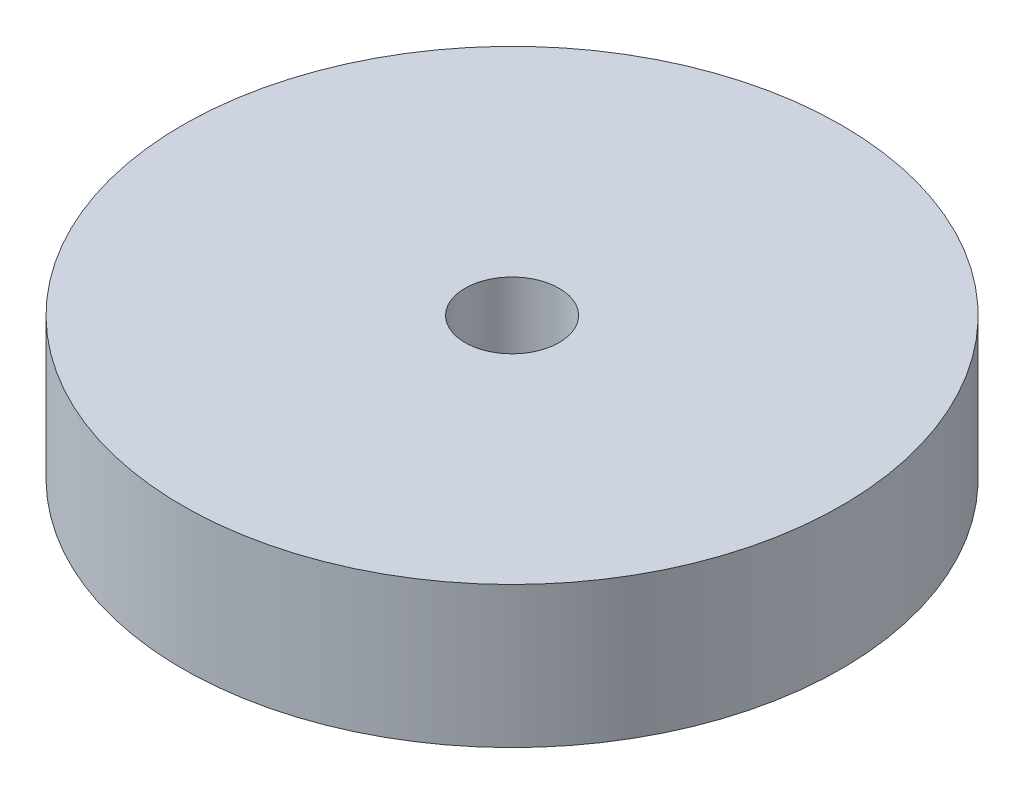
ISO-10303-21;
HEADER;
FILE_DESCRIPTION(('STEP AP214'),'2;1');
FILE_NAME('part.step','',(''),(''),'','','');
FILE_SCHEMA(('AUTOMOTIVE_DESIGN { 1 0 10303 214 1 1 1 1 }'));
ENDSEC;
DATA;
#1=APPLICATION_CONTEXT('core data for automotive mechanical design processes');
#2=APPLICATION_PROTOCOL_DEFINITION('international standard','automotive_design',2000,#1);
#3=PRODUCT_CONTEXT('',#1,'mechanical');
#4=PRODUCT('Part','Part','',(#3));
#5=PRODUCT_RELATED_PRODUCT_CATEGORY('part','',(#4));
#6=PRODUCT_DEFINITION_FORMATION('','',#4);
#7=PRODUCT_DEFINITION_CONTEXT('part definition',#1,'design');
#8=PRODUCT_DEFINITION('design','',#6,#7);
#9=PRODUCT_DEFINITION_SHAPE('','',#8);
#10=(LENGTH_UNIT() NAMED_UNIT(*) SI_UNIT(.MILLI.,.METRE.));
#11=(NAMED_UNIT(*) PLANE_ANGLE_UNIT() SI_UNIT($,.RADIAN.));
#12=(NAMED_UNIT(*) SI_UNIT($,.STERADIAN.) SOLID_ANGLE_UNIT());
#13=UNCERTAINTY_MEASURE_WITH_UNIT(LENGTH_MEASURE(1.E-05),#10,'distance_accuracy_value','');
#14=(GEOMETRIC_REPRESENTATION_CONTEXT(3) GLOBAL_UNCERTAINTY_ASSIGNED_CONTEXT((#13)) GLOBAL_UNIT_ASSIGNED_CONTEXT((#10,
#11,#12)) REPRESENTATION_CONTEXT('',''));
#15=CARTESIAN_POINT('',(0.,0.,0.));
#16=DIRECTION('',(0.,0.,1.));
#17=DIRECTION('',(1.,0.,0.));
#18=AXIS2_PLACEMENT_3D('',#15,#16,#17);
#19=CARTESIAN_POINT('',(-9.11732131638871,12.7,0.));
#20=DIRECTION('',(0.,-1.,0.));
#21=DIRECTION('',(0.,0.,-1.));
#22=AXIS2_PLACEMENT_3D('',#19,#20,#21);
#23=CYLINDRICAL_SURFACE('',#22,5.);
#24=CARTESIAN_POINT('',(-9.11732131638871,7.51908048794975,0.));
#25=DIRECTION('',(0.,-1.,0.));
#26=DIRECTION('',(0.,0.,-1.));
#27=AXIS2_PLACEMENT_3D('',#24,#25,#26);
#28=CIRCLE('',#27,5.);
#29=CARTESIAN_POINT('',(-9.11732131638871,7.51908048794975,-5.));
#30=VERTEX_POINT('',#29);
#31=EDGE_CURVE('E10',#30,#30,#28,.T.);
#32=ORIENTED_EDGE('',*,*,#31,.F.);
#33=EDGE_LOOP('',(#32));
#34=FACE_BOUND('',#33,.T.);
#35=CARTESIAN_POINT('',(-9.11732131638871,10.0190804879498,0.));
#36=DIRECTION('',(0.,-1.,0.));
#37=DIRECTION('',(0.,0.,-1.));
#38=AXIS2_PLACEMENT_3D('',#35,#36,#37);
#39=CIRCLE('',#38,5.);
#40=CARTESIAN_POINT('',(-9.11732131638871,10.0190804879498,-5.));
#41=VERTEX_POINT('',#40);
#42=EDGE_CURVE('E61',#41,#41,#39,.T.);
#43=ORIENTED_EDGE('',*,*,#42,.T.);
#44=EDGE_LOOP('',(#43));
#45=FACE_BOUND('',#44,.T.);
#46=ADVANCED_FACE('F33',(#34,#45),#23,.T.);
#47=CARTESIAN_POINT('',(-14.1173213163887,7.51908048794975,0.));
#48=DIRECTION('',(0.,1.,0.));
#49=DIRECTION('',(0.,0.,1.));
#50=AXIS2_PLACEMENT_3D('',#47,#48,#49);
#51=PLANE('',#50);
#52=CARTESIAN_POINT('',(-9.11732131638871,7.51908048794975,0.));
#53=DIRECTION('',(0.,-1.,0.));
#54=DIRECTION('',(0.,0.,-1.));
#55=AXIS2_PLACEMENT_3D('',#52,#53,#54);
#56=CIRCLE('',#55,2.5);
#57=CARTESIAN_POINT('',(-9.11732131638871,7.51908048794975,-2.5));
#58=VERTEX_POINT('',#57);
#59=EDGE_CURVE('E39',#58,#58,#56,.T.);
#60=ORIENTED_EDGE('',*,*,#59,.F.);
#61=EDGE_LOOP('',(#60));
#62=FACE_BOUND('',#61,.T.);
#63=ORIENTED_EDGE('',*,*,#31,.T.);
#64=EDGE_LOOP('',(#63));
#65=FACE_BOUND('',#64,.T.);
#66=ADVANCED_FACE('F98',(#62,#65),#51,.F.);
#67=CARTESIAN_POINT('',(-9.11732131638871,12.7,0.));
#68=DIRECTION('',(0.,-1.,0.));
#69=DIRECTION('',(0.,0.,-1.));
#70=AXIS2_PLACEMENT_3D('',#67,#68,#69);
#71=CYLINDRICAL_SURFACE('',#70,2.5);
#72=CARTESIAN_POINT('',(-9.11732131638871,12.5190804879498,0.));
#73=DIRECTION('',(0.,-1.,0.));
#74=DIRECTION('',(0.,0.,-1.));
#75=AXIS2_PLACEMENT_3D('',#72,#73,#74);
#76=CIRCLE('',#75,2.5);
#77=CARTESIAN_POINT('',(-9.11732131638871,12.5190804879498,-2.5));
#78=VERTEX_POINT('',#77);
#79=EDGE_CURVE('E43',#78,#78,#76,.T.);
#80=ORIENTED_EDGE('',*,*,#79,.F.);
#81=EDGE_LOOP('',(#80));
#82=FACE_BOUND('',#81,.T.);
#83=ORIENTED_EDGE('',*,*,#59,.T.);
#84=EDGE_LOOP('',(#83));
#85=FACE_BOUND('',#84,.T.);
#86=ADVANCED_FACE('F93',(#82,#85),#71,.F.);
#87=CARTESIAN_POINT('',(-26.6173213163887,12.5190804879498,0.));
#88=DIRECTION('',(0.,-1.,0.));
#89=DIRECTION('',(0.,0.,-1.));
#90=AXIS2_PLACEMENT_3D('',#87,#88,#89);
#91=PLANE('',#90);
#92=CARTESIAN_POINT('',(-9.11732131638871,12.5190804879498,0.));
#93=DIRECTION('',(0.,-1.,0.));
#94=DIRECTION('',(0.,0.,-1.));
#95=AXIS2_PLACEMENT_3D('',#92,#93,#94);
#96=CIRCLE('',#95,17.5);
#97=CARTESIAN_POINT('',(-9.11732131638871,12.5190804879498,-17.5));
#98=VERTEX_POINT('',#97);
#99=EDGE_CURVE('E47',#98,#98,#96,.T.);
#100=ORIENTED_EDGE('',*,*,#99,.F.);
#101=EDGE_LOOP('',(#100));
#102=FACE_BOUND('',#101,.T.);
#103=ORIENTED_EDGE('',*,*,#79,.T.);
#104=EDGE_LOOP('',(#103));
#105=FACE_BOUND('',#104,.T.);
#106=ADVANCED_FACE('F87',(#102,#105),#91,.F.);
#107=CARTESIAN_POINT('',(-9.11732131638871,12.7,0.));
#108=DIRECTION('',(0.,-1.,0.));
#109=DIRECTION('',(0.,0.,-1.));
#110=AXIS2_PLACEMENT_3D('',#107,#108,#109);
#111=CYLINDRICAL_SURFACE('',#110,17.5);
#112=CARTESIAN_POINT('',(-9.11732131638871,5.01908048794975,0.));
#113=DIRECTION('',(0.,-1.,0.));
#114=DIRECTION('',(0.,0.,-1.));
#115=AXIS2_PLACEMENT_3D('',#112,#113,#114);
#116=CIRCLE('',#115,17.5);
#117=CARTESIAN_POINT('',(-9.11732131638871,5.01908048794975,-17.5));
#118=VERTEX_POINT('',#117);
#119=EDGE_CURVE('E52',#118,#118,#116,.T.);
#120=ORIENTED_EDGE('',*,*,#119,.F.);
#121=EDGE_LOOP('',(#120));
#122=FACE_BOUND('',#121,.T.);
#123=ORIENTED_EDGE('',*,*,#99,.T.);
#124=EDGE_LOOP('',(#123));
#125=FACE_BOUND('',#124,.T.);
#126=ADVANCED_FACE('F81',(#122,#125),#111,.T.);
#127=CARTESIAN_POINT('',(-26.6173213163887,5.01908048794975,0.));
#128=DIRECTION('',(0.,1.,0.));
#129=DIRECTION('',(0.,0.,1.));
#130=AXIS2_PLACEMENT_3D('',#127,#128,#129);
#131=PLANE('',#130);
#132=CARTESIAN_POINT('',(-9.11732131638871,5.01908048794975,0.));
#133=DIRECTION('',(0.,-1.,0.));
#134=DIRECTION('',(0.,0.,-1.));
#135=AXIS2_PLACEMENT_3D('',#132,#133,#134);
#136=CIRCLE('',#135,12.5);
#137=CARTESIAN_POINT('',(-9.11732131638871,5.01908048794975,-12.5));
#138=VERTEX_POINT('',#137);
#139=EDGE_CURVE('E55',#138,#138,#136,.T.);
#140=ORIENTED_EDGE('',*,*,#139,.F.);
#141=EDGE_LOOP('',(#140));
#142=FACE_BOUND('',#141,.T.);
#143=ORIENTED_EDGE('',*,*,#119,.T.);
#144=EDGE_LOOP('',(#143));
#145=FACE_BOUND('',#144,.T.);
#146=ADVANCED_FACE('F75',(#142,#145),#131,.F.);
#147=CARTESIAN_POINT('',(-9.11732131638871,12.7,0.));
#148=DIRECTION('',(0.,-1.,0.));
#149=DIRECTION('',(0.,0.,-1.));
#150=AXIS2_PLACEMENT_3D('',#147,#148,#149);
#151=CYLINDRICAL_SURFACE('',#150,12.5);
#152=CARTESIAN_POINT('',(-9.11732131638871,10.0190804879498,0.));
#153=DIRECTION('',(0.,-1.,0.));
#154=DIRECTION('',(0.,0.,-1.));
#155=AXIS2_PLACEMENT_3D('',#152,#153,#154);
#156=CIRCLE('',#155,12.5);
#157=CARTESIAN_POINT('',(-9.11732131638871,10.0190804879498,-12.5));
#158=VERTEX_POINT('',#157);
#159=EDGE_CURVE('E58',#158,#158,#156,.T.);
#160=ORIENTED_EDGE('',*,*,#159,.F.);
#161=EDGE_LOOP('',(#160));
#162=FACE_BOUND('',#161,.T.);
#163=ORIENTED_EDGE('',*,*,#139,.T.);
#164=EDGE_LOOP('',(#163));
#165=FACE_BOUND('',#164,.T.);
#166=ADVANCED_FACE('F69',(#162,#165),#151,.F.);
#167=CARTESIAN_POINT('',(-21.6173213163887,10.0190804879498,0.));
#168=DIRECTION('',(0.,1.,0.));
#169=DIRECTION('',(0.,0.,1.));
#170=AXIS2_PLACEMENT_3D('',#167,#168,#169);
#171=PLANE('',#170);
#172=ORIENTED_EDGE('',*,*,#42,.F.);
#173=EDGE_LOOP('',(#172));
#174=FACE_BOUND('',#173,.T.);
#175=ORIENTED_EDGE('',*,*,#159,.T.);
#176=EDGE_LOOP('',(#175));
#177=FACE_BOUND('',#176,.T.);
#178=ADVANCED_FACE('F66',(#174,#177),#171,.F.);
#179=CLOSED_SHELL('',(#46,#66,#86,#106,#126,#146,#166,#178));
#180=MANIFOLD_SOLID_BREP('B2',#179);
#181=ADVANCED_BREP_SHAPE_REPRESENTATION('',(#18,#180),#14);
#182=SHAPE_DEFINITION_REPRESENTATION(#9,#181);
ENDSEC;
END-ISO-10303-21;
